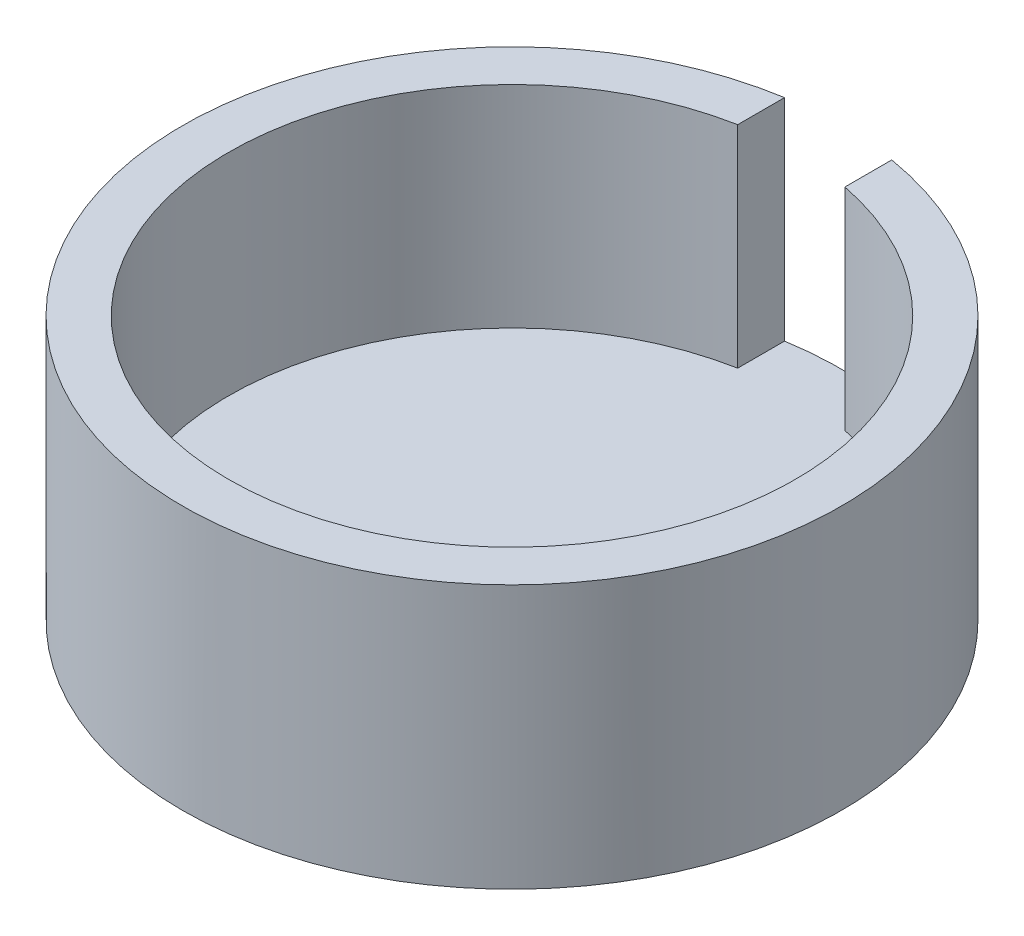
ISO-10303-21;
HEADER;
FILE_DESCRIPTION(('STEP AP214'),'2;1');
FILE_NAME('part.step','',(''),(''),'','','');
FILE_SCHEMA(('AUTOMOTIVE_DESIGN { 1 0 10303 214 1 1 1 1 }'));
ENDSEC;
DATA;
#1=APPLICATION_CONTEXT('core data for automotive mechanical design processes');
#2=APPLICATION_PROTOCOL_DEFINITION('international standard','automotive_design',2000,#1);
#3=PRODUCT_CONTEXT('',#1,'mechanical');
#4=PRODUCT('Part','Part','',(#3));
#5=PRODUCT_RELATED_PRODUCT_CATEGORY('part','',(#4));
#6=PRODUCT_DEFINITION_FORMATION('','',#4);
#7=PRODUCT_DEFINITION_CONTEXT('part definition',#1,'design');
#8=PRODUCT_DEFINITION('design','',#6,#7);
#9=PRODUCT_DEFINITION_SHAPE('','',#8);
#10=(LENGTH_UNIT() NAMED_UNIT(*) SI_UNIT(.MILLI.,.METRE.));
#11=(NAMED_UNIT(*) PLANE_ANGLE_UNIT() SI_UNIT($,.RADIAN.));
#12=(NAMED_UNIT(*) SI_UNIT($,.STERADIAN.) SOLID_ANGLE_UNIT());
#13=UNCERTAINTY_MEASURE_WITH_UNIT(LENGTH_MEASURE(1.E-05),#10,'distance_accuracy_value','');
#14=(GEOMETRIC_REPRESENTATION_CONTEXT(3) GLOBAL_UNCERTAINTY_ASSIGNED_CONTEXT((#13)) GLOBAL_UNIT_ASSIGNED_CONTEXT((#10,
#11,#12)) REPRESENTATION_CONTEXT('',''));
#15=CARTESIAN_POINT('',(0.,0.,0.));
#16=DIRECTION('',(0.,0.,1.));
#17=DIRECTION('',(1.,0.,0.));
#18=AXIS2_PLACEMENT_3D('',#15,#16,#17);
#19=CARTESIAN_POINT('',(0.,40.,0.));
#20=DIRECTION('',(0.,-1.,0.));
#21=DIRECTION('',(0.,0.,-1.));
#22=AXIS2_PLACEMENT_3D('',#19,#20,#21);
#23=CYLINDRICAL_SURFACE('',#22,50.);
#24=CARTESIAN_POINT('',(0.,0.,0.));
#25=DIRECTION('',(0.,1.,0.));
#26=DIRECTION('',(0.,0.,1.));
#27=AXIS2_PLACEMENT_3D('',#24,#25,#26);
#28=CIRCLE('',#27,50.);
#29=CARTESIAN_POINT('',(0.,0.,50.));
#30=VERTEX_POINT('',#29);
#31=EDGE_CURVE('E97',#30,#30,#28,.T.);
#32=ORIENTED_EDGE('',*,*,#31,.T.);
#33=EDGE_LOOP('',(#32));
#34=FACE_BOUND('',#33,.T.);
#35=DIRECTION('',(0.,1.,0.));
#36=VECTOR('',#35,1.);
#37=CARTESIAN_POINT('',(-8.,8.,-49.3558507170123));
#38=LINE('',#37,#36);
#39=CARTESIAN_POINT('',(-8.,8.,-49.3558507170123));
#40=VERTEX_POINT('',#39);
#41=CARTESIAN_POINT('',(-8.,40.,-49.3558507170123));
#42=VERTEX_POINT('',#41);
#43=EDGE_CURVE('E11',#40,#42,#38,.T.);
#44=ORIENTED_EDGE('',*,*,#43,.F.);
#45=CARTESIAN_POINT('',(0.,7.99999999999999,0.));
#46=DIRECTION('',(0.,-1.,0.));
#47=DIRECTION('',(0.,0.,-1.));
#48=AXIS2_PLACEMENT_3D('',#45,#46,#47);
#49=CIRCLE('',#48,50.);
#50=CARTESIAN_POINT('',(8.32376596170769,8.,-49.302281085308));
#51=VERTEX_POINT('',#50);
#52=EDGE_CURVE('E41',#51,#40,#49,.F.);
#53=ORIENTED_EDGE('',*,*,#52,.F.);
#54=DIRECTION('',(0.,-1.,0.));
#55=VECTOR('',#54,1.);
#56=CARTESIAN_POINT('',(8.3237659617077,40.,-49.302281085308));
#57=LINE('',#56,#55);
#58=CARTESIAN_POINT('',(8.3237659617077,40.,-49.302281085308));
#59=VERTEX_POINT('',#58);
#60=EDGE_CURVE('E85',#51,#59,#57,.F.);
#61=ORIENTED_EDGE('',*,*,#60,.T.);
#62=CARTESIAN_POINT('',(0.,40.,0.));
#63=DIRECTION('',(0.,1.,0.));
#64=DIRECTION('',(0.,0.,1.));
#65=AXIS2_PLACEMENT_3D('',#62,#63,#64);
#66=CIRCLE('',#65,50.);
#67=EDGE_CURVE('E92',#42,#59,#66,.T.);
#68=ORIENTED_EDGE('',*,*,#67,.F.);
#69=EDGE_LOOP('',(#44,#53,#61,#68));
#70=FACE_BOUND('',#69,.T.);
#71=ADVANCED_FACE('F37',(#34,#70),#23,.T.);
#72=CARTESIAN_POINT('',(0.,8.,0.));
#73=DIRECTION('',(0.,1.,0.));
#74=DIRECTION('',(0.,0.,1.));
#75=AXIS2_PLACEMENT_3D('',#72,#73,#74);
#76=CYLINDRICAL_SURFACE('',#75,43.);
#77=CARTESIAN_POINT('',(0.,40.,0.));
#78=DIRECTION('',(0.,1.,0.));
#79=DIRECTION('',(0.,0.,1.));
#80=AXIS2_PLACEMENT_3D('',#77,#78,#79);
#81=CIRCLE('',#80,43.);
#82=CARTESIAN_POINT('',(-8.,40.,-42.2492603485552));
#83=VERTEX_POINT('',#82);
#84=CARTESIAN_POINT('',(8.3237659617077,40.,-42.1866675647024));
#85=VERTEX_POINT('',#84);
#86=EDGE_CURVE('E84',#83,#85,#81,.T.);
#87=ORIENTED_EDGE('',*,*,#86,.T.);
#88=DIRECTION('',(0.,1.,0.));
#89=VECTOR('',#88,1.);
#90=CARTESIAN_POINT('',(8.3237659617077,8.,-42.1866675647024));
#91=LINE('',#90,#89);
#92=CARTESIAN_POINT('',(8.3237659617077,8.,-42.1866675647024));
#93=VERTEX_POINT('',#92);
#94=EDGE_CURVE('E72',#85,#93,#91,.F.);
#95=ORIENTED_EDGE('',*,*,#94,.T.);
#96=CARTESIAN_POINT('',(0.,8.,0.));
#97=DIRECTION('',(0.,1.,0.));
#98=DIRECTION('',(0.,0.,1.));
#99=AXIS2_PLACEMENT_3D('',#96,#97,#98);
#100=CIRCLE('',#99,43.);
#101=CARTESIAN_POINT('',(-8.,8.,-42.2492603485552));
#102=VERTEX_POINT('',#101);
#103=EDGE_CURVE('E105',#102,#93,#100,.T.);
#104=ORIENTED_EDGE('',*,*,#103,.F.);
#105=DIRECTION('',(0.,1.,0.));
#106=VECTOR('',#105,1.);
#107=CARTESIAN_POINT('',(-8.,8.,-42.2492603485552));
#108=LINE('',#107,#106);
#109=EDGE_CURVE('E95',#102,#83,#108,.T.);
#110=ORIENTED_EDGE('',*,*,#109,.T.);
#111=EDGE_LOOP('',(#87,#95,#104,#110));
#112=FACE_BOUND('',#111,.T.);
#113=ADVANCED_FACE('F39',(#112),#76,.F.);
#114=CARTESIAN_POINT('',(0.,40.,0.));
#115=DIRECTION('',(0.,1.,0.));
#116=DIRECTION('',(0.,0.,1.));
#117=AXIS2_PLACEMENT_3D('',#114,#115,#116);
#118=PLANE('',#117);
#119=DIRECTION('',(0.,0.,-1.));
#120=VECTOR('',#119,1.);
#121=CARTESIAN_POINT('',(8.3237659617077,40.,-52.7858699076427));
#122=LINE('',#121,#120);
#123=EDGE_CURVE('E76',#85,#59,#122,.T.);
#124=ORIENTED_EDGE('',*,*,#123,.F.);
#125=ORIENTED_EDGE('',*,*,#86,.F.);
#126=DIRECTION('',(0.,0.,1.));
#127=VECTOR('',#126,1.);
#128=CARTESIAN_POINT('',(-8.,40.,-49.3558507170123));
#129=LINE('',#128,#127);
#130=EDGE_CURVE('E47',#42,#83,#129,.T.);
#131=ORIENTED_EDGE('',*,*,#130,.F.);
#132=ORIENTED_EDGE('',*,*,#67,.T.);
#133=EDGE_LOOP('',(#124,#125,#131,#132));
#134=FACE_BOUND('',#133,.T.);
#135=ADVANCED_FACE('F90',(#134),#118,.T.);
#136=CARTESIAN_POINT('',(0.,0.,0.));
#137=DIRECTION('',(0.,1.,0.));
#138=DIRECTION('',(0.,0.,1.));
#139=AXIS2_PLACEMENT_3D('',#136,#137,#138);
#140=PLANE('',#139);
#141=ORIENTED_EDGE('',*,*,#31,.F.);
#142=EDGE_LOOP('',(#141));
#143=FACE_BOUND('',#142,.T.);
#144=ADVANCED_FACE('F137',(#143),#140,.F.);
#145=CARTESIAN_POINT('',(0.,8.,0.));
#146=DIRECTION('',(0.,1.,0.));
#147=DIRECTION('',(0.,0.,1.));
#148=AXIS2_PLACEMENT_3D('',#145,#146,#147);
#149=PLANE('',#148);
#150=ORIENTED_EDGE('',*,*,#103,.T.);
#151=DIRECTION('',(0.,0.,-1.));
#152=VECTOR('',#151,1.);
#153=CARTESIAN_POINT('',(8.3237659617077,8.,-52.7858699076427));
#154=LINE('',#153,#152);
#155=EDGE_CURVE('E79',#93,#51,#154,.T.);
#156=ORIENTED_EDGE('',*,*,#155,.T.);
#157=ORIENTED_EDGE('',*,*,#52,.T.);
#158=DIRECTION('',(0.,0.,1.));
#159=VECTOR('',#158,1.);
#160=CARTESIAN_POINT('',(-8.,8.,-49.3558507170123));
#161=LINE('',#160,#159);
#162=EDGE_CURVE('E121',#40,#102,#161,.T.);
#163=ORIENTED_EDGE('',*,*,#162,.T.);
#164=EDGE_LOOP('',(#150,#156,#157,#163));
#165=FACE_BOUND('',#164,.T.);
#166=ADVANCED_FACE('F119',(#165),#149,.T.);
#167=CARTESIAN_POINT('',(-8.,8.,-49.3558507170123));
#168=DIRECTION('',(-1.,0.,0.));
#169=DIRECTION('',(0.,0.,1.));
#170=AXIS2_PLACEMENT_3D('',#167,#168,#169);
#171=PLANE('',#170);
#172=ORIENTED_EDGE('',*,*,#130,.T.);
#173=ORIENTED_EDGE('',*,*,#109,.F.);
#174=ORIENTED_EDGE('',*,*,#162,.F.);
#175=ORIENTED_EDGE('',*,*,#43,.T.);
#176=EDGE_LOOP('',(#172,#173,#174,#175));
#177=FACE_BOUND('',#176,.T.);
#178=ADVANCED_FACE('F127',(#177),#171,.F.);
#179=CARTESIAN_POINT('',(8.3237659617077,8.,-52.7858699076427));
#180=DIRECTION('',(1.,0.,0.));
#181=DIRECTION('',(0.,0.,-1.));
#182=AXIS2_PLACEMENT_3D('',#179,#180,#181);
#183=PLANE('',#182);
#184=ORIENTED_EDGE('',*,*,#123,.T.);
#185=ORIENTED_EDGE('',*,*,#60,.F.);
#186=ORIENTED_EDGE('',*,*,#155,.F.);
#187=ORIENTED_EDGE('',*,*,#94,.F.);
#188=EDGE_LOOP('',(#184,#185,#186,#187));
#189=FACE_BOUND('',#188,.T.);
#190=ADVANCED_FACE('F74',(#189),#183,.F.);
#191=CLOSED_SHELL('',(#71,#113,#135,#144,#166,#178,#190));
#192=MANIFOLD_SOLID_BREP('B2',#191);
#193=ADVANCED_BREP_SHAPE_REPRESENTATION('',(#18,#192),#14);
#194=SHAPE_DEFINITION_REPRESENTATION(#9,#193);
ENDSEC;
END-ISO-10303-21;
